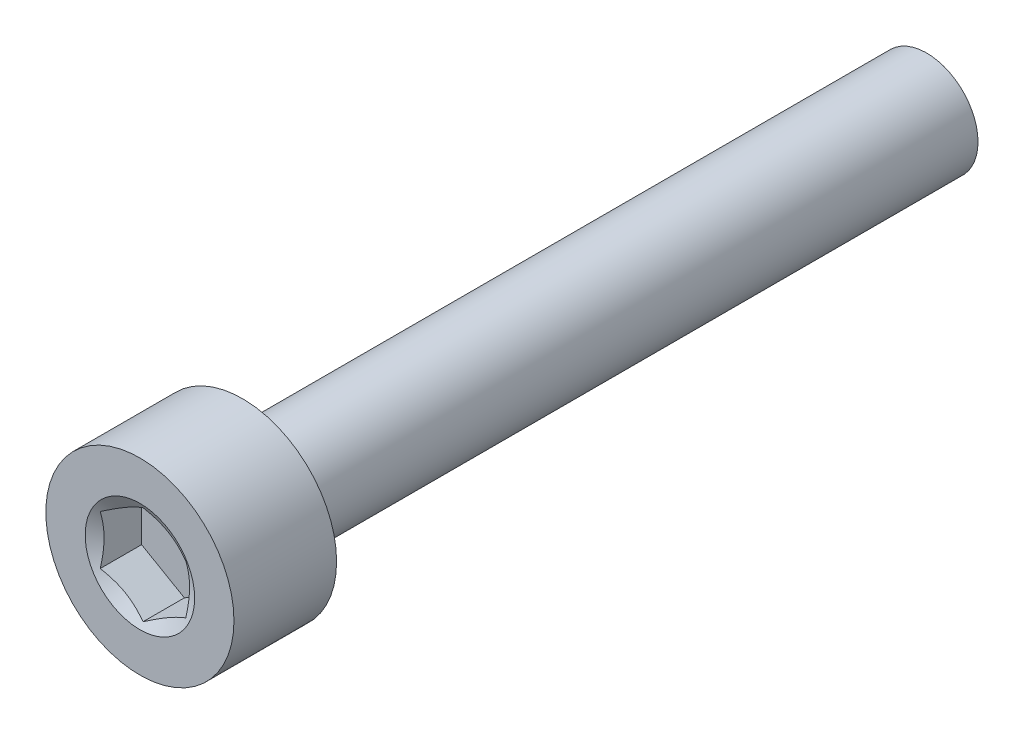
ISO-10303-21;
HEADER;
FILE_DESCRIPTION(('STEP AP214'),'2;1');
FILE_NAME('part.step','',(''),(''),'','','');
FILE_SCHEMA(('AUTOMOTIVE_DESIGN { 1 0 10303 214 1 1 1 1 }'));
ENDSEC;
DATA;
#1=APPLICATION_CONTEXT('core data for automotive mechanical design processes');
#2=APPLICATION_PROTOCOL_DEFINITION('international standard','automotive_design',2000,#1);
#3=PRODUCT_CONTEXT('',#1,'mechanical');
#4=PRODUCT('Part','Part','',(#3));
#5=PRODUCT_RELATED_PRODUCT_CATEGORY('part','',(#4));
#6=PRODUCT_DEFINITION_FORMATION('','',#4);
#7=PRODUCT_DEFINITION_CONTEXT('part definition',#1,'design');
#8=PRODUCT_DEFINITION('design','',#6,#7);
#9=PRODUCT_DEFINITION_SHAPE('','',#8);
#10=(LENGTH_UNIT() NAMED_UNIT(*) SI_UNIT(.MILLI.,.METRE.));
#11=(NAMED_UNIT(*) PLANE_ANGLE_UNIT() SI_UNIT($,.RADIAN.));
#12=(NAMED_UNIT(*) SI_UNIT($,.STERADIAN.) SOLID_ANGLE_UNIT());
#13=UNCERTAINTY_MEASURE_WITH_UNIT(LENGTH_MEASURE(1.E-05),#10,'distance_accuracy_value','');
#14=(GEOMETRIC_REPRESENTATION_CONTEXT(3) GLOBAL_UNCERTAINTY_ASSIGNED_CONTEXT((#13)) GLOBAL_UNIT_ASSIGNED_CONTEXT((#10,
#11,#12)) REPRESENTATION_CONTEXT('',''));
#15=CARTESIAN_POINT('',(0.,0.,0.));
#16=DIRECTION('',(0.,0.,1.));
#17=DIRECTION('',(1.,0.,0.));
#18=AXIS2_PLACEMENT_3D('',#15,#16,#17);
#19=CARTESIAN_POINT('',(0.,0.,0.));
#20=DIRECTION('',(0.,0.,1.));
#21=DIRECTION('',(1.,0.,0.));
#22=AXIS2_PLACEMENT_3D('',#19,#20,#21);
#23=PLANE('',#22);
#24=CARTESIAN_POINT('',(0.,0.,0.));
#25=DIRECTION('',(0.,0.,1.));
#26=DIRECTION('',(1.,0.,0.));
#27=AXIS2_PLACEMENT_3D('',#24,#25,#26);
#28=CIRCLE('',#27,2.75);
#29=CARTESIAN_POINT('',(2.75,0.,0.));
#30=VERTEX_POINT('',#29);
#31=EDGE_CURVE('E125',#30,#30,#28,.T.);
#32=ORIENTED_EDGE('',*,*,#31,.F.);
#33=EDGE_LOOP('',(#32));
#34=FACE_BOUND('',#33,.T.);
#35=CARTESIAN_POINT('',(0.,0.,0.));
#36=DIRECTION('',(0.,0.,1.));
#37=DIRECTION('',(1.,0.,0.));
#38=AXIS2_PLACEMENT_3D('',#35,#36,#37);
#39=CIRCLE('',#38,1.5);
#40=CARTESIAN_POINT('',(1.5,0.,0.));
#41=VERTEX_POINT('',#40);
#42=EDGE_CURVE('E52',#41,#41,#39,.F.);
#43=ORIENTED_EDGE('',*,*,#42,.F.);
#44=EDGE_LOOP('',(#43));
#45=FACE_BOUND('',#44,.T.);
#46=ADVANCED_FACE('F38',(#34,#45),#23,.F.);
#47=CARTESIAN_POINT('',(0.,0.,3.));
#48=DIRECTION('',(0.,0.,-1.));
#49=DIRECTION('',(-1.,0.,0.));
#50=AXIS2_PLACEMENT_3D('',#47,#48,#49);
#51=CYLINDRICAL_SURFACE('',#50,2.75);
#52=CARTESIAN_POINT('',(0.,0.,3.));
#53=DIRECTION('',(0.,0.,1.));
#54=DIRECTION('',(1.,0.,0.));
#55=AXIS2_PLACEMENT_3D('',#52,#53,#54);
#56=CIRCLE('',#55,2.75);
#57=CARTESIAN_POINT('',(2.75,0.,3.));
#58=VERTEX_POINT('',#57);
#59=EDGE_CURVE('E126',#58,#58,#56,.T.);
#60=ORIENTED_EDGE('',*,*,#59,.F.);
#61=EDGE_LOOP('',(#60));
#62=FACE_BOUND('',#61,.T.);
#63=ORIENTED_EDGE('',*,*,#31,.T.);
#64=EDGE_LOOP('',(#63));
#65=FACE_BOUND('',#64,.T.);
#66=ADVANCED_FACE('F40',(#62,#65),#51,.T.);
#67=CARTESIAN_POINT('',(0.,0.,3.));
#68=DIRECTION('',(0.,0.,1.));
#69=DIRECTION('',(1.,0.,0.));
#70=AXIS2_PLACEMENT_3D('',#67,#68,#69);
#71=PLANE('',#70);
#72=CARTESIAN_POINT('',(0.,0.,3.));
#73=DIRECTION('',(0.,0.,1.));
#74=DIRECTION('',(1.,0.,0.));
#75=AXIS2_PLACEMENT_3D('',#72,#73,#74);
#76=CIRCLE('',#75,1.6);
#77=CARTESIAN_POINT('',(1.6,0.,3.));
#78=VERTEX_POINT('',#77);
#79=EDGE_CURVE('E239',#78,#78,#76,.T.);
#80=ORIENTED_EDGE('',*,*,#79,.F.);
#81=EDGE_LOOP('',(#80));
#82=FACE_BOUND('',#81,.T.);
#83=ORIENTED_EDGE('',*,*,#59,.T.);
#84=EDGE_LOOP('',(#83));
#85=FACE_BOUND('',#84,.T.);
#86=ADVANCED_FACE('F140',(#82,#85),#71,.T.);
#87=CARTESIAN_POINT('',(0.,0.,1.38579367521123));
#88=DIRECTION('',(0.,0.,1.));
#89=DIRECTION('',(1.,0.,0.));
#90=AXIS2_PLACEMENT_3D('',#87,#88,#89);
#91=CYLINDRICAL_SURFACE('',#90,1.5);
#92=CARTESIAN_POINT('',(0.,0.,-20.));
#93=DIRECTION('',(0.,0.,1.));
#94=DIRECTION('',(1.,0.,0.));
#95=AXIS2_PLACEMENT_3D('',#92,#93,#94);
#96=CIRCLE('',#95,1.5);
#97=CARTESIAN_POINT('',(1.5,0.,-20.));
#98=VERTEX_POINT('',#97);
#99=EDGE_CURVE('E122',#98,#98,#96,.T.);
#100=ORIENTED_EDGE('',*,*,#99,.T.);
#101=EDGE_LOOP('',(#100));
#102=FACE_BOUND('',#101,.T.);
#103=ORIENTED_EDGE('',*,*,#42,.T.);
#104=EDGE_LOOP('',(#103));
#105=FACE_BOUND('',#104,.T.);
#106=ADVANCED_FACE('F133',(#102,#105),#91,.T.);
#107=CARTESIAN_POINT('',(0.,0.,-20.));
#108=DIRECTION('',(0.,0.,1.));
#109=DIRECTION('',(1.,0.,0.));
#110=AXIS2_PLACEMENT_3D('',#107,#108,#109);
#111=PLANE('',#110);
#112=ORIENTED_EDGE('',*,*,#99,.F.);
#113=EDGE_LOOP('',(#112));
#114=FACE_BOUND('',#113,.T.);
#115=ADVANCED_FACE('F147',(#114),#111,.F.);
#116=CARTESIAN_POINT('',(0.,0.,3.));
#117=DIRECTION('',(0.,0.,1.));
#118=DIRECTION('',(1.,0.,0.));
#119=AXIS2_PLACEMENT_3D('',#116,#117,#118);
#120=CONICAL_SURFACE('',#119,1.6,1.0471975511966);
#121=ORIENTED_EDGE('',*,*,#79,.T.);
#122=EDGE_LOOP('',(#121));
#123=FACE_BOUND('',#122,.T.);
#124=CARTESIAN_POINT('',(1.25,-1.8906292080098,3.38479842062628));
#125=CARTESIAN_POINT('',(1.25,-1.83639477356087,3.35868635856045));
#126=CARTESIAN_POINT('',(1.25,-1.78203061593172,3.33283911628555));
#127=CARTESIAN_POINT('',(1.25,-1.67297334701083,3.28182417312442));
#128=CARTESIAN_POINT('',(1.25,-1.61828018061734,3.25665659017252));
#129=CARTESIAN_POINT('',(1.25,-1.50819003857713,3.20701387368785));
#130=CARTESIAN_POINT('',(1.25,-1.45279081411397,3.18254370527507));
#131=CARTESIAN_POINT('',(1.25,-1.34153519227952,3.13467235574425));
#132=CARTESIAN_POINT('',(1.25,-1.28567881828498,3.11127112036313));
#133=CARTESIAN_POINT('',(1.25,-1.17185361501402,3.06518630343901));
#134=CARTESIAN_POINT('',(1.25,-1.1138692018677,3.04254070587884));
#135=CARTESIAN_POINT('',(1.25,-0.997216920669018,2.99909032513322));
#136=CARTESIAN_POINT('',(1.25,-0.938548968638296,2.97828577089228));
#137=CARTESIAN_POINT('',(1.25,-0.76160459473271,2.91948868534859));
#138=CARTESIAN_POINT('',(1.25,-0.642072631649258,2.88497934219164));
#139=CARTESIAN_POINT('',(1.25,-0.460502768560476,2.84467658626466));
#140=CARTESIAN_POINT('',(1.25,-0.399740695009108,2.8331657232502));
#141=CARTESIAN_POINT('',(1.25,-0.277510736354788,2.81471408625808));
#142=CARTESIAN_POINT('',(1.25,-0.216042906906932,2.80777295440108));
#143=CARTESIAN_POINT('',(1.25,-0.0934923562021848,2.7991031197708));
#144=CARTESIAN_POINT('',(1.25,-0.0324142221349099,2.79731124454084));
#145=CARTESIAN_POINT('',(1.25,0.0896719647750095,2.7989220800043));
#146=CARTESIAN_POINT('',(1.25,0.150680013575972,2.8023250765713));
#147=CARTESIAN_POINT('',(1.25,0.299962675247283,2.81670821322589));
#148=CARTESIAN_POINT('',(1.25,0.387972653280541,2.83043788081936));
#149=CARTESIAN_POINT('',(1.25,0.562317298274864,2.86617541102754));
#150=CARTESIAN_POINT('',(1.25,0.648649863114121,2.88819303466002));
#151=CARTESIAN_POINT('',(1.25,0.777786825091142,2.925953198438));
#152=CARTESIAN_POINT('',(1.25,0.821255880338846,2.93950807773833));
#153=CARTESIAN_POINT('',(1.25,0.907741617530765,2.96791002935544));
#154=CARTESIAN_POINT('',(1.25,0.950758560569026,2.98275630405923));
#155=CARTESIAN_POINT('',(1.25,1.03639643063822,3.01352189749485));
#156=CARTESIAN_POINT('',(1.25,1.07901741966839,3.02944104489848));
#157=CARTESIAN_POINT('',(1.25,1.1639205026284,3.06217626338549));
#158=CARTESIAN_POINT('',(1.25,1.20620253914819,3.07899248286652));
#159=CARTESIAN_POINT('',(1.25,1.31606319794051,3.12381109883176));
#160=CARTESIAN_POINT('',(1.25,1.38340160592036,3.15240174712219));
#161=CARTESIAN_POINT('',(1.25,1.51744767977343,3.2110294171784));
#162=CARTESIAN_POINT('',(1.25,1.58415529240383,3.24106655975584));
#163=CARTESIAN_POINT('',(1.25,1.78354795434272,3.3328279530818));
#164=CARTESIAN_POINT('',(1.25,1.91547704185408,3.39619131487725));
#165=CARTESIAN_POINT('',(1.25,2.17818818692885,3.5256496722919));
#166=CARTESIAN_POINT('',(1.25,2.3089684988903,3.5917481660913));
#167=CARTESIAN_POINT('',(1.25,2.56961573192914,3.72567352573903));
#168=CARTESIAN_POINT('',(1.25,2.69948278031212,3.79350014434488));
#169=CARTESIAN_POINT('',(1.25,2.94591444625758,3.92364264060362));
#170=CARTESIAN_POINT('',(1.25,3.06253741834579,3.98584841948319));
#171=CARTESIAN_POINT('',(1.25,3.29540727931263,4.11097100101839));
#172=CARTESIAN_POINT('',(1.25,3.4116541522715,4.17388783327831));
#173=CARTESIAN_POINT('',(1.25,3.64354248158091,4.30008022910081));
#174=CARTESIAN_POINT('',(1.25,3.7591847245361,4.36335434918185));
#175=CARTESIAN_POINT('',(1.25,3.99023521913385,4.49031291793058));
#176=CARTESIAN_POINT('',(1.25,4.10564348379204,4.55399734290209));
#177=CARTESIAN_POINT('',(1.25,4.22096821477828,4.61783176515654));
#178=B_SPLINE_CURVE_WITH_KNOTS('',3,(#124,#125,#126,#127,#128,#129,#130,#131,#132,#133,#134,
#135,#136,#137,#138,#139,#140,#141,#142,#143,#144,#145,#146,#147,#148,#149,#150,#151,#152,#153,
#154,#155,#156,#157,#158,#159,#160,#161,#162,#163,#164,#165,#166,#167,#168,#169,#170,#171,#172,
#173,#174,#175,#176,#177),.UNSPECIFIED.,.F.,.F.,(4,2,2,2,2,2,2,2,2,2,2,2,2,2,2,2,2,2,2,2,2,2,2,
2,2,2,4),(0.,0.180581613724479,0.361194363168465,0.542873382162824,0.724543168167793,
0.911258674885688,1.0979973682369,1.47044999120011,1.65584020789446,1.8412159039925,
2.02430744528374,2.20740906245842,2.4740850831215,2.7410761652085,2.87766095987675,
3.01416198578491,3.15064126511117,3.287143191881,3.50658804442397,3.7260512569647,
4.16506156536558,4.6046518515127,5.04417959485995,5.44070461601995,5.83724620752528,
6.23270793432602,6.62814702332852),.UNSPECIFIED.);
#179=CARTESIAN_POINT('',(1.25,-0.721687836487033,2.90957290262993));
#180=VERTEX_POINT('',#179);
#181=CARTESIAN_POINT('',(1.25,0.721687836487033,2.90957290262993));
#182=VERTEX_POINT('',#181);
#183=EDGE_CURVE('E106',#180,#182,#178,.T.);
#184=ORIENTED_EDGE('',*,*,#183,.F.);
#185=CARTESIAN_POINT('',(-0.00020000000000024,-1.4434911430279,2.90963957729596));
#186=CARTESIAN_POINT('',(0.054733305231765,-1.41177538446487,2.89131881739362));
#187=CARTESIAN_POINT('',(0.110140786500239,-1.37978586023939,2.87465620883057));
#188=CARTESIAN_POINT('',(0.22191536760034,-1.31525277575269,2.8455702065757));
#189=CARTESIAN_POINT('',(0.27828445484171,-1.28270806805991,2.83315710460598));
#190=CARTESIAN_POINT('',(0.390323974086984,-1.21802202146378,2.81383259026594));
#191=CARTESIAN_POINT('',(0.445977158459229,-1.1858906404852,2.80679259207736));
#192=CARTESIAN_POINT('',(0.557545653908391,-1.12147653960455,2.79838533526057));
#193=CARTESIAN_POINT('',(0.6134605589376,-1.08919405413422,2.79701111783466));
#194=CARTESIAN_POINT('',(0.717957921181724,-1.02886247391297,2.79985623999785));
#195=CARTESIAN_POINT('',(0.766555949881315,-1.00080438896118,2.80337700144995));
#196=CARTESIAN_POINT('',(0.863435362173237,-0.944871034195503,2.81454001532919));
#197=CARTESIAN_POINT('',(0.911716410192162,-0.91699595812502,2.82218608820261));
#198=CARTESIAN_POINT('',(1.00879588385404,-0.860947097873547,2.84130235733046));
#199=CARTESIAN_POINT('',(1.0575820103519,-0.83278041460729,2.85285365960959));
#200=CARTESIAN_POINT('',(1.1544262522921,-0.776867365453649,2.87907121732382));
#201=CARTESIAN_POINT('',(1.20248561032696,-0.749120282155141,2.89373130476904));
#202=CARTESIAN_POINT('',(1.2502,-0.721572366433195,2.90963957729596));
#203=B_SPLINE_CURVE_WITH_KNOTS('',3,(#185,#186,#187,#188,#189,#190,#191,#192,#193,#194,#195,
#196,#197,#198,#199,#200,#201,#202),.UNSPECIFIED.,.F.,.F.,(4,2,2,2,2,2,2,2,4),(0.,
0.198150821029559,0.39677819631522,0.590488617354399,0.783961049317181,0.952480056398645,
1.1211553973001,1.2935743034359,1.4656542697693),.UNSPECIFIED.);
#204=CARTESIAN_POINT('',(0.,-1.44337567297406,2.90957290262993));
#205=VERTEX_POINT('',#204);
#206=EDGE_CURVE('E195',#205,#180,#203,.T.);
#207=ORIENTED_EDGE('',*,*,#206,.F.);
#208=CARTESIAN_POINT('',(-1.2502,-0.721572366433194,2.90963957729596));
#209=CARTESIAN_POINT('',(-1.19526669476823,-0.753288124996229,2.89131881739362));
#210=CARTESIAN_POINT('',(-1.13985921349976,-0.785277649221702,2.87465620883057));
#211=CARTESIAN_POINT('',(-1.02808463239966,-0.849810733708403,2.8455702065757));
#212=CARTESIAN_POINT('',(-0.97171554515829,-0.882355441401181,2.83315710460598));
#213=CARTESIAN_POINT('',(-0.859676025913016,-0.947041487997317,2.81383259026594));
#214=CARTESIAN_POINT('',(-0.804022841540771,-0.979172868975892,2.80679259207736));
#215=CARTESIAN_POINT('',(-0.692454346091609,-1.04358696985655,2.79838533526057));
#216=CARTESIAN_POINT('',(-0.6365394410624,-1.07586945532687,2.79701111783466));
#217=CARTESIAN_POINT('',(-0.532042078818276,-1.13620103554812,2.79985623999785));
#218=CARTESIAN_POINT('',(-0.483444050118685,-1.16425912049992,2.80337700144995));
#219=CARTESIAN_POINT('',(-0.386564637826762,-1.22019247526559,2.81454001532919));
#220=CARTESIAN_POINT('',(-0.338283589807837,-1.24806755133608,2.82218608820261));
#221=CARTESIAN_POINT('',(-0.241204116145957,-1.30411641158755,2.84130235733046));
#222=CARTESIAN_POINT('',(-0.192417989648101,-1.33228309485381,2.85285365960959));
#223=CARTESIAN_POINT('',(-0.0955737477078982,-1.38819614400745,2.87907121732382));
#224=CARTESIAN_POINT('',(-0.0475143896730361,-1.41594322730596,2.89373130476904));
#225=CARTESIAN_POINT('',(0.000199999999999612,-1.4434911430279,2.90963957729596));
#226=B_SPLINE_CURVE_WITH_KNOTS('',3,(#208,#209,#210,#211,#212,#213,#214,#215,#216,#217,#218,
#219,#220,#221,#222,#223,#224,#225),.UNSPECIFIED.,.F.,.F.,(4,2,2,2,2,2,2,2,4),(0.,
0.198150821029559,0.396778196315221,0.590488617354399,0.783961049317181,0.952480056398645,
1.1211553973001,1.2935743034359,1.4656542697693),.UNSPECIFIED.);
#227=CARTESIAN_POINT('',(-1.25,-0.721687836488056,2.90957290262923));
#228=VERTEX_POINT('',#227);
#229=EDGE_CURVE('E189',#228,#205,#226,.T.);
#230=ORIENTED_EDGE('',*,*,#229,.F.);
#231=CARTESIAN_POINT('',(-1.25,-1.8906292080098,3.38479842062628));
#232=CARTESIAN_POINT('',(-1.25,-1.83639477356087,3.35868635856045));
#233=CARTESIAN_POINT('',(-1.25,-1.78203061593172,3.33283911628555));
#234=CARTESIAN_POINT('',(-1.25,-1.67297334701083,3.28182417312442));
#235=CARTESIAN_POINT('',(-1.25,-1.61828018061733,3.25665659017252));
#236=CARTESIAN_POINT('',(-1.25,-1.50819003857712,3.20701387368785));
#237=CARTESIAN_POINT('',(-1.25,-1.45279081411397,3.18254370527507));
#238=CARTESIAN_POINT('',(-1.25,-1.34153519227952,3.13467235574425));
#239=CARTESIAN_POINT('',(-1.25,-1.28567881828498,3.11127112036313));
#240=CARTESIAN_POINT('',(-1.25,-1.17185361501402,3.06518630343901));
#241=CARTESIAN_POINT('',(-1.25,-1.1138692018677,3.04254070587884));
#242=CARTESIAN_POINT('',(-1.25,-0.997216920669016,2.99909032513322));
#243=CARTESIAN_POINT('',(-1.25,-0.938548968638294,2.97828577089228));
#244=CARTESIAN_POINT('',(-1.25,-0.761604594732709,2.91948868534859));
#245=CARTESIAN_POINT('',(-1.25,-0.642072631649257,2.88497934219164));
#246=CARTESIAN_POINT('',(-1.25,-0.460502768560475,2.84467658626466));
#247=CARTESIAN_POINT('',(-1.25,-0.399740695009106,2.8331657232502));
#248=CARTESIAN_POINT('',(-1.25,-0.277510736354787,2.81471408625808));
#249=CARTESIAN_POINT('',(-1.25,-0.216042906906931,2.80777295440108));
#250=CARTESIAN_POINT('',(-1.25,-0.0934923562021838,2.7991031197708));
#251=CARTESIAN_POINT('',(-1.25,-0.032414222134909,2.79731124454084));
#252=CARTESIAN_POINT('',(-1.25,0.0896719647750104,2.7989220800043));
#253=CARTESIAN_POINT('',(-1.25,0.150680013575973,2.8023250765713));
#254=CARTESIAN_POINT('',(-1.25,0.299962675247283,2.81670821322589));
#255=CARTESIAN_POINT('',(-1.25,0.387972653280542,2.83043788081936));
#256=CARTESIAN_POINT('',(-1.25,0.562317298274865,2.86617541102754));
#257=CARTESIAN_POINT('',(-1.25,0.648649863114122,2.88819303466002));
#258=CARTESIAN_POINT('',(-1.25,0.777786825091143,2.925953198438));
#259=CARTESIAN_POINT('',(-1.25,0.821255880338847,2.93950807773833));
#260=CARTESIAN_POINT('',(-1.25,0.907741617530766,2.96791002935544));
#261=CARTESIAN_POINT('',(-1.25,0.950758560569026,2.98275630405923));
#262=CARTESIAN_POINT('',(-1.25,1.03639643063822,3.01352189749485));
#263=CARTESIAN_POINT('',(-1.25,1.07901741966839,3.02944104489848));
#264=CARTESIAN_POINT('',(-1.25,1.16392050262841,3.06217626338549));
#265=CARTESIAN_POINT('',(-1.25,1.20620253914819,3.07899248286652));
#266=CARTESIAN_POINT('',(-1.25,1.31606319794051,3.12381109883176));
#267=CARTESIAN_POINT('',(-1.25,1.38340160592036,3.15240174712219));
#268=CARTESIAN_POINT('',(-1.25,1.51744767977343,3.2110294171784));
#269=CARTESIAN_POINT('',(-1.25,1.58415529240383,3.24106655975584));
#270=CARTESIAN_POINT('',(-1.25,1.78354795434272,3.33282795308179));
#271=CARTESIAN_POINT('',(-1.25,1.91547704185408,3.39619131487725));
#272=CARTESIAN_POINT('',(-1.25,2.17818818692885,3.5256496722919));
#273=CARTESIAN_POINT('',(-1.25,2.3089684988903,3.5917481660913));
#274=CARTESIAN_POINT('',(-1.25,2.56961573192914,3.72567352573903));
#275=CARTESIAN_POINT('',(-1.25,2.69948278031212,3.79350014434488));
#276=CARTESIAN_POINT('',(-1.25,2.94591444625758,3.92364264060362));
#277=CARTESIAN_POINT('',(-1.25,3.06253741834579,3.98584841948319));
#278=CARTESIAN_POINT('',(-1.25,3.29540727931263,4.11097100101839));
#279=CARTESIAN_POINT('',(-1.25,3.41165415227149,4.17388783327831));
#280=CARTESIAN_POINT('',(-1.25,3.64354248158091,4.30008022910081));
#281=CARTESIAN_POINT('',(-1.25,3.7591847245361,4.36335434918185));
#282=CARTESIAN_POINT('',(-1.25,3.99023521913384,4.49031291793057));
#283=CARTESIAN_POINT('',(-1.25,4.10564348379204,4.55399734290209));
#284=CARTESIAN_POINT('',(-1.25,4.22096821477828,4.61783176515653));
#285=B_SPLINE_CURVE_WITH_KNOTS('',3,(#231,#232,#233,#234,#235,#236,#237,#238,#239,#240,#241,
#242,#243,#244,#245,#246,#247,#248,#249,#250,#251,#252,#253,#254,#255,#256,#257,#258,#259,#260,
#261,#262,#263,#264,#265,#266,#267,#268,#269,#270,#271,#272,#273,#274,#275,#276,#277,#278,#279,
#280,#281,#282,#283,#284),.UNSPECIFIED.,.F.,.F.,(4,2,2,2,2,2,2,2,2,2,2,2,2,2,2,2,2,2,2,2,2,2,2,
2,2,2,4),(0.,0.180581613724479,0.361194363168465,0.542873382162824,0.724543168167794,
0.911258674885689,1.0979973682369,1.47044999120011,1.65584020789446,1.8412159039925,
2.02430744528374,2.20740906245842,2.4740850831215,2.7410761652085,2.87766095987675,
3.01416198578491,3.15064126511117,3.287143191881,3.50658804442396,3.72605125696469,
4.16506156536558,4.6046518515127,5.04417959485995,5.44070461601994,5.83724620752527,
6.23270793432601,6.62814702332852),.UNSPECIFIED.);
#286=CARTESIAN_POINT('',(-1.25,0.721687836487033,2.90957290262993));
#287=VERTEX_POINT('',#286);
#288=EDGE_CURVE('E59',#287,#228,#285,.F.);
#289=ORIENTED_EDGE('',*,*,#288,.F.);
#290=CARTESIAN_POINT('',(0.000199999999999743,1.4434911430279,2.90963957729596));
#291=CARTESIAN_POINT('',(-0.0547333052317655,1.41177538446487,2.89131881739362));
#292=CARTESIAN_POINT('',(-0.11014078650024,1.37978586023939,2.87465620883057));
#293=CARTESIAN_POINT('',(-0.22191536760034,1.31525277575269,2.8455702065757));
#294=CARTESIAN_POINT('',(-0.278284454841711,1.28270806805992,2.83315710460598));
#295=CARTESIAN_POINT('',(-0.390323974086985,1.21802202146378,2.81383259026594));
#296=CARTESIAN_POINT('',(-0.44597715845923,1.1858906404852,2.80679259207737));
#297=CARTESIAN_POINT('',(-0.557545653908392,1.12147653960455,2.79838533526057));
#298=CARTESIAN_POINT('',(-0.6134605589376,1.08919405413422,2.79701111783466));
#299=CARTESIAN_POINT('',(-0.717957921181725,1.02886247391297,2.79985623999785));
#300=CARTESIAN_POINT('',(-0.766555949881316,1.00080438896118,2.80337700144995));
#301=CARTESIAN_POINT('',(-0.863435362173238,0.944871034195504,2.81454001532919));
#302=CARTESIAN_POINT('',(-0.911716410192163,0.916995958125021,2.82218608820261));
#303=CARTESIAN_POINT('',(-1.00879588385404,0.860947097873547,2.84130235733046));
#304=CARTESIAN_POINT('',(-1.0575820103519,0.832780414607291,2.85285365960959));
#305=CARTESIAN_POINT('',(-1.1544262522921,0.776867365453649,2.87907121732382));
#306=CARTESIAN_POINT('',(-1.20248561032696,0.749120282155141,2.89373130476904));
#307=CARTESIAN_POINT('',(-1.2502,0.721572366433195,2.90963957729596));
#308=B_SPLINE_CURVE_WITH_KNOTS('',3,(#290,#291,#292,#293,#294,#295,#296,#297,#298,#299,#300,
#301,#302,#303,#304,#305,#306,#307),.UNSPECIFIED.,.F.,.F.,(4,2,2,2,2,2,2,2,4),(0.,
0.198150821029559,0.396778196315221,0.5904886173544,0.783961049317182,0.952480056398646,
1.1211553973001,1.2935743034359,1.4656542697693),.UNSPECIFIED.);
#309=CARTESIAN_POINT('',(0.,1.44337567297407,2.90957290262993));
#310=VERTEX_POINT('',#309);
#311=EDGE_CURVE('E11',#310,#287,#308,.T.);
#312=ORIENTED_EDGE('',*,*,#311,.F.);
#313=CARTESIAN_POINT('',(1.2502,0.721572366433195,2.90963957729596));
#314=CARTESIAN_POINT('',(1.19526669476823,0.75328812499623,2.89131881739362));
#315=CARTESIAN_POINT('',(1.13985921349976,0.785277649221703,2.87465620883057));
#316=CARTESIAN_POINT('',(1.02808463239966,0.849810733708404,2.8455702065757));
#317=CARTESIAN_POINT('',(0.971715545158289,0.882355441401183,2.83315710460598));
#318=CARTESIAN_POINT('',(0.859676025913015,0.947041487997318,2.81383259026595));
#319=CARTESIAN_POINT('',(0.80402284154077,0.979172868975894,2.80679259207737));
#320=CARTESIAN_POINT('',(0.692454346091608,1.04358696985655,2.79838533526057));
#321=CARTESIAN_POINT('',(0.6365394410624,1.07586945532687,2.79701111783466));
#322=CARTESIAN_POINT('',(0.532042078818275,1.13620103554813,2.79985623999785));
#323=CARTESIAN_POINT('',(0.483444050118684,1.16425912049992,2.80337700144995));
#324=CARTESIAN_POINT('',(0.386564637826761,1.22019247526559,2.81454001532919));
#325=CARTESIAN_POINT('',(0.338283589807837,1.24806755133608,2.82218608820261));
#326=CARTESIAN_POINT('',(0.241204116145957,1.30411641158755,2.84130235733046));
#327=CARTESIAN_POINT('',(0.1924179896481,1.33228309485381,2.85285365960959));
#328=CARTESIAN_POINT('',(0.0955737477078978,1.38819614400745,2.87907121732382));
#329=CARTESIAN_POINT('',(0.0475143896730356,1.41594322730596,2.89373130476904));
#330=CARTESIAN_POINT('',(-0.000200000000000167,1.4434911430279,2.90963957729596));
#331=B_SPLINE_CURVE_WITH_KNOTS('',3,(#313,#314,#315,#316,#317,#318,#319,#320,#321,#322,#323,
#324,#325,#326,#327,#328,#329,#330),.UNSPECIFIED.,.F.,.F.,(4,2,2,2,2,2,2,2,4),(0.,
0.198150821029559,0.396778196315221,0.5904886173544,0.783961049317182,0.952480056398646,
1.1211553973001,1.2935743034359,1.4656542697693),.UNSPECIFIED.);
#332=EDGE_CURVE('E97',#182,#310,#331,.T.);
#333=ORIENTED_EDGE('',*,*,#332,.F.);
#334=EDGE_LOOP('',(#184,#207,#230,#289,#312,#333));
#335=FACE_BOUND('',#334,.T.);
#336=ADVANCED_FACE('F96',(#123,#335),#120,.F.);
#337=CARTESIAN_POINT('',(1.25,0.721687836487033,1.7));
#338=DIRECTION('',(0.,0.,-1.));
#339=DIRECTION('',(-1.,0.,0.));
#340=AXIS2_PLACEMENT_3D('',#337,#338,#339);
#341=PLANE('',#340);
#342=DIRECTION('',(-0.866025403784439,0.5,0.));
#343=VECTOR('',#342,1.);
#344=CARTESIAN_POINT('',(1.25,0.721687836487033,1.7));
#345=LINE('',#344,#343);
#346=CARTESIAN_POINT('',(1.25,0.721687836487033,1.7));
#347=VERTEX_POINT('',#346);
#348=CARTESIAN_POINT('',(0.,1.44337567297407,1.7));
#349=VERTEX_POINT('',#348);
#350=EDGE_CURVE('E105',#347,#349,#345,.T.);
#351=ORIENTED_EDGE('',*,*,#350,.T.);
#352=DIRECTION('',(-0.866025403784439,-0.5,0.));
#353=VECTOR('',#352,1.);
#354=CARTESIAN_POINT('',(0.,1.44337567297407,1.7));
#355=LINE('',#354,#353);
#356=CARTESIAN_POINT('',(-1.25,0.721687836487033,1.7));
#357=VERTEX_POINT('',#356);
#358=EDGE_CURVE('E110',#349,#357,#355,.T.);
#359=ORIENTED_EDGE('',*,*,#358,.T.);
#360=DIRECTION('',(0.,-1.,0.));
#361=VECTOR('',#360,1.);
#362=CARTESIAN_POINT('',(-1.25,0.721687836487033,1.7));
#363=LINE('',#362,#361);
#364=CARTESIAN_POINT('',(-1.25,-0.721687836487032,1.7));
#365=VERTEX_POINT('',#364);
#366=EDGE_CURVE('E221',#357,#365,#363,.T.);
#367=ORIENTED_EDGE('',*,*,#366,.T.);
#368=DIRECTION('',(0.866025403784439,-0.5,0.));
#369=VECTOR('',#368,1.);
#370=CARTESIAN_POINT('',(-1.25,-0.721687836487032,1.7));
#371=LINE('',#370,#369);
#372=CARTESIAN_POINT('',(0.,-1.44337567297406,1.7));
#373=VERTEX_POINT('',#372);
#374=EDGE_CURVE('E225',#365,#373,#371,.T.);
#375=ORIENTED_EDGE('',*,*,#374,.T.);
#376=DIRECTION('',(0.866025403784439,0.5,0.));
#377=VECTOR('',#376,1.);
#378=CARTESIAN_POINT('',(0.,-1.44337567297406,1.7));
#379=LINE('',#378,#377);
#380=CARTESIAN_POINT('',(1.25,-0.721687836487033,1.7));
#381=VERTEX_POINT('',#380);
#382=EDGE_CURVE('E118',#373,#381,#379,.T.);
#383=ORIENTED_EDGE('',*,*,#382,.T.);
#384=DIRECTION('',(0.,1.,0.));
#385=VECTOR('',#384,1.);
#386=CARTESIAN_POINT('',(1.25,-0.721687836487033,1.7));
#387=LINE('',#386,#385);
#388=EDGE_CURVE('E113',#381,#347,#387,.T.);
#389=ORIENTED_EDGE('',*,*,#388,.T.);
#390=EDGE_LOOP('',(#351,#359,#367,#375,#383,#389));
#391=FACE_BOUND('',#390,.T.);
#392=ADVANCED_FACE('F175',(#391),#341,.F.);
#393=CARTESIAN_POINT('',(0.,1.44337567297407,1.7));
#394=DIRECTION('',(-0.5,0.866025403784439,0.));
#395=DIRECTION('',(-0.866025403784439,-0.5,0.));
#396=AXIS2_PLACEMENT_3D('',#393,#394,#395);
#397=PLANE('',#396);
#398=DIRECTION('',(0.,0.,1.));
#399=VECTOR('',#398,1.);
#400=CARTESIAN_POINT('',(0.,1.44337567297407,1.7));
#401=LINE('',#400,#399);
#402=EDGE_CURVE('E103',#349,#310,#401,.T.);
#403=ORIENTED_EDGE('',*,*,#402,.T.);
#404=ORIENTED_EDGE('',*,*,#311,.T.);
#405=DIRECTION('',(0.,0.,1.));
#406=VECTOR('',#405,1.);
#407=CARTESIAN_POINT('',(-1.25,0.721687836487033,1.7));
#408=LINE('',#407,#406);
#409=EDGE_CURVE('E112',#357,#287,#408,.T.);
#410=ORIENTED_EDGE('',*,*,#409,.F.);
#411=ORIENTED_EDGE('',*,*,#358,.F.);
#412=EDGE_LOOP('',(#403,#404,#410,#411));
#413=FACE_BOUND('',#412,.T.);
#414=ADVANCED_FACE('F108',(#413),#397,.F.);
#415=CARTESIAN_POINT('',(-1.25,0.721687836487033,1.7));
#416=DIRECTION('',(-1.,0.,0.));
#417=DIRECTION('',(0.,0.,1.));
#418=AXIS2_PLACEMENT_3D('',#415,#416,#417);
#419=PLANE('',#418);
#420=ORIENTED_EDGE('',*,*,#409,.T.);
#421=ORIENTED_EDGE('',*,*,#288,.T.);
#422=DIRECTION('',(0.,0.,1.));
#423=VECTOR('',#422,1.);
#424=CARTESIAN_POINT('',(-1.25,-0.721687836487032,1.7));
#425=LINE('',#424,#423);
#426=EDGE_CURVE('E115',#365,#228,#425,.T.);
#427=ORIENTED_EDGE('',*,*,#426,.F.);
#428=ORIENTED_EDGE('',*,*,#366,.F.);
#429=EDGE_LOOP('',(#420,#421,#427,#428));
#430=FACE_BOUND('',#429,.T.);
#431=ADVANCED_FACE('F210',(#430),#419,.F.);
#432=CARTESIAN_POINT('',(-1.25,-0.721687836487032,1.7));
#433=DIRECTION('',(-0.5,-0.866025403784439,0.));
#434=DIRECTION('',(0.866025403784439,-0.5,0.));
#435=AXIS2_PLACEMENT_3D('',#432,#433,#434);
#436=PLANE('',#435);
#437=ORIENTED_EDGE('',*,*,#426,.T.);
#438=ORIENTED_EDGE('',*,*,#229,.T.);
#439=DIRECTION('',(0.,0.,1.));
#440=VECTOR('',#439,1.);
#441=CARTESIAN_POINT('',(0.,-1.44337567297406,1.7));
#442=LINE('',#441,#440);
#443=EDGE_CURVE('E235',#373,#205,#442,.T.);
#444=ORIENTED_EDGE('',*,*,#443,.F.);
#445=ORIENTED_EDGE('',*,*,#374,.F.);
#446=EDGE_LOOP('',(#437,#438,#444,#445));
#447=FACE_BOUND('',#446,.T.);
#448=ADVANCED_FACE('F205',(#447),#436,.F.);
#449=CARTESIAN_POINT('',(0.,-1.44337567297406,1.7));
#450=DIRECTION('',(0.5,-0.866025403784439,0.));
#451=DIRECTION('',(0.866025403784439,0.5,0.));
#452=AXIS2_PLACEMENT_3D('',#449,#450,#451);
#453=PLANE('',#452);
#454=ORIENTED_EDGE('',*,*,#443,.T.);
#455=ORIENTED_EDGE('',*,*,#206,.T.);
#456=DIRECTION('',(0.,0.,1.));
#457=VECTOR('',#456,1.);
#458=CARTESIAN_POINT('',(1.25,-0.721687836487033,1.7));
#459=LINE('',#458,#457);
#460=EDGE_CURVE('E232',#381,#180,#459,.T.);
#461=ORIENTED_EDGE('',*,*,#460,.F.);
#462=ORIENTED_EDGE('',*,*,#382,.F.);
#463=EDGE_LOOP('',(#454,#455,#461,#462));
#464=FACE_BOUND('',#463,.T.);
#465=ADVANCED_FACE('F202',(#464),#453,.F.);
#466=CARTESIAN_POINT('',(1.25,-0.721687836487033,1.7));
#467=DIRECTION('',(1.,0.,0.));
#468=DIRECTION('',(0.,1.,0.));
#469=AXIS2_PLACEMENT_3D('',#466,#467,#468);
#470=PLANE('',#469);
#471=ORIENTED_EDGE('',*,*,#460,.T.);
#472=ORIENTED_EDGE('',*,*,#183,.T.);
#473=DIRECTION('',(0.,0.,1.));
#474=VECTOR('',#473,1.);
#475=CARTESIAN_POINT('',(1.25,0.721687836487033,1.7));
#476=LINE('',#475,#474);
#477=EDGE_CURVE('E66',#347,#182,#476,.T.);
#478=ORIENTED_EDGE('',*,*,#477,.F.);
#479=ORIENTED_EDGE('',*,*,#388,.F.);
#480=EDGE_LOOP('',(#471,#472,#478,#479));
#481=FACE_BOUND('',#480,.T.);
#482=ADVANCED_FACE('F156',(#481),#470,.F.);
#483=CARTESIAN_POINT('',(1.25,0.721687836487033,1.7));
#484=DIRECTION('',(0.5,0.866025403784439,0.));
#485=DIRECTION('',(-0.866025403784439,0.5,0.));
#486=AXIS2_PLACEMENT_3D('',#483,#484,#485);
#487=PLANE('',#486);
#488=ORIENTED_EDGE('',*,*,#477,.T.);
#489=ORIENTED_EDGE('',*,*,#332,.T.);
#490=ORIENTED_EDGE('',*,*,#402,.F.);
#491=ORIENTED_EDGE('',*,*,#350,.F.);
#492=EDGE_LOOP('',(#488,#489,#490,#491));
#493=FACE_BOUND('',#492,.T.);
#494=ADVANCED_FACE('F102',(#493),#487,.F.);
#495=CLOSED_SHELL('',(#46,#66,#86,#106,#115,#336,#392,#414,#431,#448,#465,#482,#494));
#496=MANIFOLD_SOLID_BREP('B2',#495);
#497=ADVANCED_BREP_SHAPE_REPRESENTATION('',(#18,#496),#14);
#498=SHAPE_DEFINITION_REPRESENTATION(#9,#497);
ENDSEC;
END-ISO-10303-21;
